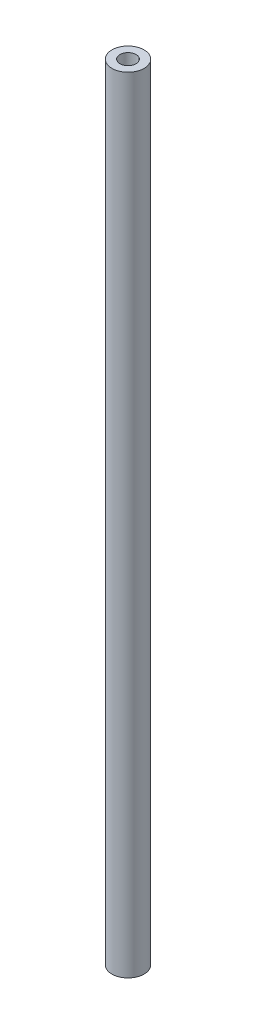
ISO-10303-21;
HEADER;
FILE_DESCRIPTION(('STEP AP214'),'2;1');
FILE_NAME('part.step','',(''),(''),'','','');
FILE_SCHEMA(('AUTOMOTIVE_DESIGN { 1 0 10303 214 1 1 1 1 }'));
ENDSEC;
DATA;
#1=APPLICATION_CONTEXT('core data for automotive mechanical design processes');
#2=APPLICATION_PROTOCOL_DEFINITION('international standard','automotive_design',2000,#1);
#3=PRODUCT_CONTEXT('',#1,'mechanical');
#4=PRODUCT('Part','Part','',(#3));
#5=PRODUCT_RELATED_PRODUCT_CATEGORY('part','',(#4));
#6=PRODUCT_DEFINITION_FORMATION('','',#4);
#7=PRODUCT_DEFINITION_CONTEXT('part definition',#1,'design');
#8=PRODUCT_DEFINITION('design','',#6,#7);
#9=PRODUCT_DEFINITION_SHAPE('','',#8);
#10=(LENGTH_UNIT() NAMED_UNIT(*) SI_UNIT(.MILLI.,.METRE.));
#11=(NAMED_UNIT(*) PLANE_ANGLE_UNIT() SI_UNIT($,.RADIAN.));
#12=(NAMED_UNIT(*) SI_UNIT($,.STERADIAN.) SOLID_ANGLE_UNIT());
#13=UNCERTAINTY_MEASURE_WITH_UNIT(LENGTH_MEASURE(1.E-05),#10,'distance_accuracy_value','');
#14=(GEOMETRIC_REPRESENTATION_CONTEXT(3) GLOBAL_UNCERTAINTY_ASSIGNED_CONTEXT((#13)) GLOBAL_UNIT_ASSIGNED_CONTEXT((#10,
#11,#12)) REPRESENTATION_CONTEXT('',''));
#15=CARTESIAN_POINT('',(0.,0.,0.));
#16=DIRECTION('',(0.,0.,1.));
#17=DIRECTION('',(1.,0.,0.));
#18=AXIS2_PLACEMENT_3D('',#15,#16,#17);
#19=CARTESIAN_POINT('',(0.,488.,0.));
#20=DIRECTION('',(0.,1.,0.));
#21=DIRECTION('',(0.,0.,1.));
#22=AXIS2_PLACEMENT_3D('',#19,#20,#21);
#23=PLANE('',#22);
#24=CARTESIAN_POINT('',(0.,488.,0.));
#25=DIRECTION('',(0.,1.,0.));
#26=DIRECTION('',(0.,0.,1.));
#27=AXIS2_PLACEMENT_3D('',#24,#25,#26);
#28=CIRCLE('',#27,10.);
#29=CARTESIAN_POINT('',(0.,488.,-10.));
#30=VERTEX_POINT('',#29);
#31=EDGE_CURVE('E10',#30,#30,#28,.T.);
#32=ORIENTED_EDGE('',*,*,#31,.T.);
#33=EDGE_LOOP('',(#32));
#34=FACE_BOUND('',#33,.T.);
#35=CARTESIAN_POINT('',(0.,488.,0.));
#36=DIRECTION('',(0.,1.,0.));
#37=DIRECTION('',(0.,0.,1.));
#38=AXIS2_PLACEMENT_3D('',#35,#36,#37);
#39=CIRCLE('',#38,5.);
#40=CARTESIAN_POINT('',(0.,488.,-5.));
#41=VERTEX_POINT('',#40);
#42=EDGE_CURVE('E50',#41,#41,#39,.T.);
#43=ORIENTED_EDGE('',*,*,#42,.F.);
#44=EDGE_LOOP('',(#43));
#45=FACE_BOUND('',#44,.T.);
#46=ADVANCED_FACE('F37',(#34,#45),#23,.T.);
#47=CARTESIAN_POINT('',(0.,0.,0.));
#48=DIRECTION('',(0.,1.,0.));
#49=DIRECTION('',(0.,0.,1.));
#50=AXIS2_PLACEMENT_3D('',#47,#48,#49);
#51=PLANE('',#50);
#52=CARTESIAN_POINT('',(0.,0.,0.));
#53=DIRECTION('',(0.,1.,0.));
#54=DIRECTION('',(0.,0.,1.));
#55=AXIS2_PLACEMENT_3D('',#52,#53,#54);
#56=CIRCLE('',#55,10.);
#57=CARTESIAN_POINT('',(0.,0.,-10.));
#58=VERTEX_POINT('',#57);
#59=EDGE_CURVE('E41',#58,#58,#56,.T.);
#60=ORIENTED_EDGE('',*,*,#59,.F.);
#61=EDGE_LOOP('',(#60));
#62=FACE_BOUND('',#61,.T.);
#63=CARTESIAN_POINT('',(0.,0.,0.));
#64=DIRECTION('',(0.,1.,0.));
#65=DIRECTION('',(0.,0.,1.));
#66=AXIS2_PLACEMENT_3D('',#63,#64,#65);
#67=CIRCLE('',#66,5.);
#68=CARTESIAN_POINT('',(0.,0.,-5.));
#69=VERTEX_POINT('',#68);
#70=EDGE_CURVE('E52',#69,#69,#67,.T.);
#71=ORIENTED_EDGE('',*,*,#70,.T.);
#72=EDGE_LOOP('',(#71));
#73=FACE_BOUND('',#72,.T.);
#74=ADVANCED_FACE('F64',(#62,#73),#51,.F.);
#75=CARTESIAN_POINT('',(0.,488.,0.));
#76=DIRECTION('',(0.,-1.,0.));
#77=DIRECTION('',(0.,0.,-1.));
#78=AXIS2_PLACEMENT_3D('',#75,#76,#77);
#79=CYLINDRICAL_SURFACE('',#78,10.);
#80=CARTESIAN_POINT('',(0.,488.,-10.));
#81=CARTESIAN_POINT('',(0.,482.916666666667,-10.));
#82=CARTESIAN_POINT('',(0.,477.833333333333,-10.));
#83=CARTESIAN_POINT('',(0.,467.666666666667,-10.));
#84=CARTESIAN_POINT('',(0.,462.583333333333,-10.));
#85=CARTESIAN_POINT('',(0.,452.416666666667,-10.));
#86=CARTESIAN_POINT('',(0.,447.333333333333,-10.));
#87=CARTESIAN_POINT('',(0.,437.166666666667,-10.));
#88=CARTESIAN_POINT('',(0.,432.083333333333,-10.));
#89=CARTESIAN_POINT('',(0.,421.916666666667,-10.));
#90=CARTESIAN_POINT('',(0.,416.833333333333,-10.));
#91=CARTESIAN_POINT('',(0.,406.666666666667,-10.));
#92=CARTESIAN_POINT('',(0.,401.583333333333,-10.));
#93=CARTESIAN_POINT('',(0.,391.416666666667,-10.));
#94=CARTESIAN_POINT('',(0.,386.333333333333,-10.));
#95=CARTESIAN_POINT('',(0.,376.166666666667,-10.));
#96=CARTESIAN_POINT('',(0.,371.083333333333,-10.));
#97=CARTESIAN_POINT('',(0.,360.916666666667,-10.));
#98=CARTESIAN_POINT('',(0.,355.833333333333,-10.));
#99=CARTESIAN_POINT('',(0.,345.666666666667,-10.));
#100=CARTESIAN_POINT('',(0.,340.583333333333,-10.));
#101=CARTESIAN_POINT('',(0.,330.416666666667,-10.));
#102=CARTESIAN_POINT('',(0.,325.333333333333,-10.));
#103=CARTESIAN_POINT('',(0.,315.166666666667,-10.));
#104=CARTESIAN_POINT('',(0.,310.083333333333,-10.));
#105=CARTESIAN_POINT('',(0.,299.916666666667,-10.));
#106=CARTESIAN_POINT('',(0.,294.833333333333,-10.));
#107=CARTESIAN_POINT('',(0.,284.666666666667,-10.));
#108=CARTESIAN_POINT('',(0.,279.583333333333,-10.));
#109=CARTESIAN_POINT('',(0.,269.416666666667,-10.));
#110=CARTESIAN_POINT('',(0.,264.333333333333,-10.));
#111=CARTESIAN_POINT('',(0.,254.166666666667,-10.));
#112=CARTESIAN_POINT('',(0.,249.083333333333,-10.));
#113=CARTESIAN_POINT('',(0.,238.916666666667,-10.));
#114=CARTESIAN_POINT('',(0.,233.833333333333,-10.));
#115=CARTESIAN_POINT('',(0.,223.666666666667,-10.));
#116=CARTESIAN_POINT('',(0.,218.583333333333,-10.));
#117=CARTESIAN_POINT('',(0.,208.416666666667,-10.));
#118=CARTESIAN_POINT('',(0.,203.333333333333,-10.));
#119=CARTESIAN_POINT('',(0.,193.166666666667,-10.));
#120=CARTESIAN_POINT('',(0.,188.083333333333,-10.));
#121=CARTESIAN_POINT('',(0.,177.916666666667,-10.));
#122=CARTESIAN_POINT('',(0.,172.833333333333,-10.));
#123=CARTESIAN_POINT('',(0.,162.666666666667,-10.));
#124=CARTESIAN_POINT('',(0.,157.583333333333,-10.));
#125=CARTESIAN_POINT('',(0.,147.416666666667,-10.));
#126=CARTESIAN_POINT('',(0.,142.333333333333,-10.));
#127=CARTESIAN_POINT('',(0.,132.166666666667,-10.));
#128=CARTESIAN_POINT('',(0.,127.083333333333,-10.));
#129=CARTESIAN_POINT('',(0.,116.916666666667,-10.));
#130=CARTESIAN_POINT('',(0.,111.833333333333,-10.));
#131=CARTESIAN_POINT('',(0.,101.666666666667,-10.));
#132=CARTESIAN_POINT('',(0.,96.5833333333333,-10.));
#133=CARTESIAN_POINT('',(0.,86.4166666666666,-10.));
#134=CARTESIAN_POINT('',(0.,81.3333333333333,-10.));
#135=CARTESIAN_POINT('',(0.,71.1666666666666,-10.));
#136=CARTESIAN_POINT('',(0.,66.0833333333333,-10.));
#137=CARTESIAN_POINT('',(0.,55.9166666666666,-10.));
#138=CARTESIAN_POINT('',(0.,50.8333333333333,-10.));
#139=CARTESIAN_POINT('',(0.,40.6666666666666,-10.));
#140=CARTESIAN_POINT('',(0.,35.5833333333333,-10.));
#141=CARTESIAN_POINT('',(0.,25.4166666666666,-10.));
#142=CARTESIAN_POINT('',(0.,20.3333333333333,-10.));
#143=CARTESIAN_POINT('',(0.,10.1666666666666,-10.));
#144=CARTESIAN_POINT('',(0.,5.08333333333327,-10.));
#145=CARTESIAN_POINT('',(0.,0.,-10.));
#146=B_SPLINE_CURVE_WITH_KNOTS('',3,(#80,#81,#82,#83,#84,#85,#86,#87,#88,#89,#90,#91,#92,#93,
#94,#95,#96,#97,#98,#99,#100,#101,#102,#103,#104,#105,#106,#107,#108,#109,#110,#111,#112,#113,
#114,#115,#116,#117,#118,#119,#120,#121,#122,#123,#124,#125,#126,#127,#128,#129,#130,#131,#132,
#133,#134,#135,#136,#137,#138,#139,#140,#141,#142,#143,#144,#145),.UNSPECIFIED.,.F.,.F.,(4,2,2,
2,2,2,2,2,2,2,2,2,2,2,2,2,2,2,2,2,2,2,2,2,2,2,2,2,2,2,2,2,4),(0.,15.25,30.5,45.75,
61.0000000000001,76.25,91.5,106.75,122.,137.25,152.5,167.75,183.,198.25,213.5,228.75,244.,
259.25,274.5,289.75,305.,320.25,335.5,350.75,366.,381.25,396.5,411.75,427.,442.25,457.5,472.75,
488.),.UNSPECIFIED.);
#147=EDGE_CURVE('BSEAM39',#30,#58,#146,.T.);
#148=ORIENTED_EDGE('',*,*,#31,.F.);
#149=ORIENTED_EDGE('',*,*,#59,.T.);
#150=ORIENTED_EDGE('',*,*,#147,.T.);
#151=ORIENTED_EDGE('',*,*,#147,.F.);
#152=EDGE_LOOP('',(#148,#150,#149,#151));
#153=FACE_BOUND('',#152,.T.);
#154=ADVANCED_FACE('F39',(#153),#79,.T.);
#155=CARTESIAN_POINT('',(0.,488.,0.));
#156=DIRECTION('',(0.,-1.,0.));
#157=DIRECTION('',(0.,0.,-1.));
#158=AXIS2_PLACEMENT_3D('',#155,#156,#157);
#159=CYLINDRICAL_SURFACE('',#158,5.);
#160=CARTESIAN_POINT('',(0.,488.,-5.));
#161=CARTESIAN_POINT('',(0.,482.916666666667,-5.));
#162=CARTESIAN_POINT('',(0.,477.833333333333,-5.));
#163=CARTESIAN_POINT('',(0.,467.666666666667,-5.));
#164=CARTESIAN_POINT('',(0.,462.583333333333,-5.));
#165=CARTESIAN_POINT('',(0.,452.416666666667,-5.));
#166=CARTESIAN_POINT('',(0.,447.333333333333,-5.));
#167=CARTESIAN_POINT('',(0.,437.166666666667,-5.));
#168=CARTESIAN_POINT('',(0.,432.083333333333,-5.));
#169=CARTESIAN_POINT('',(0.,421.916666666667,-5.));
#170=CARTESIAN_POINT('',(0.,416.833333333333,-5.));
#171=CARTESIAN_POINT('',(0.,406.666666666667,-5.));
#172=CARTESIAN_POINT('',(0.,401.583333333333,-5.));
#173=CARTESIAN_POINT('',(0.,391.416666666667,-5.));
#174=CARTESIAN_POINT('',(0.,386.333333333333,-5.));
#175=CARTESIAN_POINT('',(0.,376.166666666667,-5.));
#176=CARTESIAN_POINT('',(0.,371.083333333333,-5.));
#177=CARTESIAN_POINT('',(0.,360.916666666667,-5.));
#178=CARTESIAN_POINT('',(0.,355.833333333333,-5.));
#179=CARTESIAN_POINT('',(0.,345.666666666667,-5.));
#180=CARTESIAN_POINT('',(0.,340.583333333333,-5.));
#181=CARTESIAN_POINT('',(0.,330.416666666667,-5.));
#182=CARTESIAN_POINT('',(0.,325.333333333333,-5.));
#183=CARTESIAN_POINT('',(0.,315.166666666667,-5.));
#184=CARTESIAN_POINT('',(0.,310.083333333333,-5.));
#185=CARTESIAN_POINT('',(0.,299.916666666667,-5.));
#186=CARTESIAN_POINT('',(0.,294.833333333333,-5.));
#187=CARTESIAN_POINT('',(0.,284.666666666667,-5.));
#188=CARTESIAN_POINT('',(0.,279.583333333333,-5.));
#189=CARTESIAN_POINT('',(0.,269.416666666667,-5.));
#190=CARTESIAN_POINT('',(0.,264.333333333333,-5.));
#191=CARTESIAN_POINT('',(0.,254.166666666667,-5.));
#192=CARTESIAN_POINT('',(0.,249.083333333333,-5.));
#193=CARTESIAN_POINT('',(0.,238.916666666667,-5.));
#194=CARTESIAN_POINT('',(0.,233.833333333333,-5.));
#195=CARTESIAN_POINT('',(0.,223.666666666667,-5.));
#196=CARTESIAN_POINT('',(0.,218.583333333333,-5.));
#197=CARTESIAN_POINT('',(0.,208.416666666667,-5.));
#198=CARTESIAN_POINT('',(0.,203.333333333333,-5.));
#199=CARTESIAN_POINT('',(0.,193.166666666667,-5.));
#200=CARTESIAN_POINT('',(0.,188.083333333333,-5.));
#201=CARTESIAN_POINT('',(0.,177.916666666667,-5.));
#202=CARTESIAN_POINT('',(0.,172.833333333333,-5.));
#203=CARTESIAN_POINT('',(0.,162.666666666667,-5.));
#204=CARTESIAN_POINT('',(0.,157.583333333333,-5.));
#205=CARTESIAN_POINT('',(0.,147.416666666667,-5.));
#206=CARTESIAN_POINT('',(0.,142.333333333333,-5.));
#207=CARTESIAN_POINT('',(0.,132.166666666667,-5.));
#208=CARTESIAN_POINT('',(0.,127.083333333333,-5.));
#209=CARTESIAN_POINT('',(0.,116.916666666667,-5.));
#210=CARTESIAN_POINT('',(0.,111.833333333333,-5.));
#211=CARTESIAN_POINT('',(0.,101.666666666667,-5.));
#212=CARTESIAN_POINT('',(0.,96.5833333333333,-5.));
#213=CARTESIAN_POINT('',(0.,86.4166666666666,-5.));
#214=CARTESIAN_POINT('',(0.,81.3333333333333,-5.));
#215=CARTESIAN_POINT('',(0.,71.1666666666666,-5.));
#216=CARTESIAN_POINT('',(0.,66.0833333333333,-5.));
#217=CARTESIAN_POINT('',(0.,55.9166666666666,-5.));
#218=CARTESIAN_POINT('',(0.,50.8333333333333,-5.));
#219=CARTESIAN_POINT('',(0.,40.6666666666666,-5.));
#220=CARTESIAN_POINT('',(0.,35.5833333333333,-5.));
#221=CARTESIAN_POINT('',(0.,25.4166666666666,-5.));
#222=CARTESIAN_POINT('',(0.,20.3333333333333,-5.));
#223=CARTESIAN_POINT('',(0.,10.1666666666666,-5.));
#224=CARTESIAN_POINT('',(0.,5.08333333333327,-5.));
#225=CARTESIAN_POINT('',(0.,0.,-5.));
#226=B_SPLINE_CURVE_WITH_KNOTS('',3,(#160,#161,#162,#163,#164,#165,#166,#167,#168,#169,#170,
#171,#172,#173,#174,#175,#176,#177,#178,#179,#180,#181,#182,#183,#184,#185,#186,#187,#188,#189,
#190,#191,#192,#193,#194,#195,#196,#197,#198,#199,#200,#201,#202,#203,#204,#205,#206,#207,#208,
#209,#210,#211,#212,#213,#214,#215,#216,#217,#218,#219,#220,#221,#222,#223,#224,#225),
.UNSPECIFIED.,.F.,.F.,(4,2,2,2,2,2,2,2,2,2,2,2,2,2,2,2,2,2,2,2,2,2,2,2,2,2,2,2,2,2,2,2,4),(0.,
15.25,30.5,45.75,61.0000000000001,76.25,91.5,106.75,122.,137.25,152.5,167.75,183.,198.25,213.5,
228.75,244.,259.25,274.5,289.75,305.,320.25,335.5,350.75,366.,381.25,396.5,411.75,427.,442.25,
457.5,472.75,488.),.UNSPECIFIED.);
#227=EDGE_CURVE('BSEAM60',#41,#69,#226,.T.);
#228=ORIENTED_EDGE('',*,*,#42,.T.);
#229=ORIENTED_EDGE('',*,*,#70,.F.);
#230=ORIENTED_EDGE('',*,*,#227,.T.);
#231=ORIENTED_EDGE('',*,*,#227,.F.);
#232=EDGE_LOOP('',(#228,#230,#229,#231));
#233=FACE_BOUND('',#232,.T.);
#234=ADVANCED_FACE('F60',(#233),#159,.F.);
#235=CLOSED_SHELL('',(#46,#74,#154,#234));
#236=MANIFOLD_SOLID_BREP('B2',#235);
#237=ADVANCED_BREP_SHAPE_REPRESENTATION('',(#18,#236),#14);
#238=SHAPE_DEFINITION_REPRESENTATION(#9,#237);
ENDSEC;
END-ISO-10303-21;
